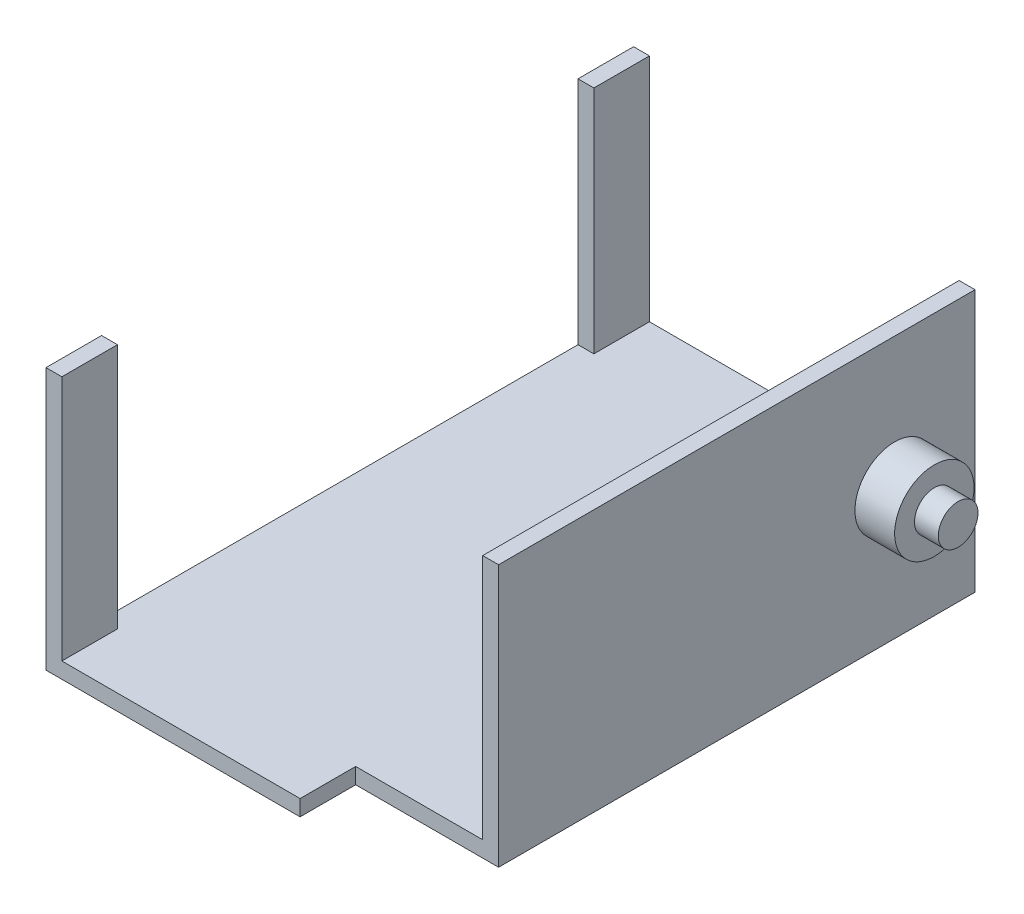
ISO-10303-21;
HEADER;
FILE_DESCRIPTION(('STEP AP214'),'2;1');
FILE_NAME('part.step','',(''),(''),'','','');
FILE_SCHEMA(('AUTOMOTIVE_DESIGN { 1 0 10303 214 1 1 1 1 }'));
ENDSEC;
DATA;
#1=APPLICATION_CONTEXT('core data for automotive mechanical design processes');
#2=APPLICATION_PROTOCOL_DEFINITION('international standard','automotive_design',2000,#1);
#3=PRODUCT_CONTEXT('',#1,'mechanical');
#4=PRODUCT('Part','Part','',(#3));
#5=PRODUCT_RELATED_PRODUCT_CATEGORY('part','',(#4));
#6=PRODUCT_DEFINITION_FORMATION('','',#4);
#7=PRODUCT_DEFINITION_CONTEXT('part definition',#1,'design');
#8=PRODUCT_DEFINITION('design','',#6,#7);
#9=PRODUCT_DEFINITION_SHAPE('','',#8);
#10=(LENGTH_UNIT() NAMED_UNIT(*) SI_UNIT(.MILLI.,.METRE.));
#11=(NAMED_UNIT(*) PLANE_ANGLE_UNIT() SI_UNIT($,.RADIAN.));
#12=(NAMED_UNIT(*) SI_UNIT($,.STERADIAN.) SOLID_ANGLE_UNIT());
#13=UNCERTAINTY_MEASURE_WITH_UNIT(LENGTH_MEASURE(1.E-05),#10,'distance_accuracy_value','');
#14=(GEOMETRIC_REPRESENTATION_CONTEXT(3) GLOBAL_UNCERTAINTY_ASSIGNED_CONTEXT((#13)) GLOBAL_UNIT_ASSIGNED_CONTEXT((#10,
#11,#12)) REPRESENTATION_CONTEXT('',''));
#15=CARTESIAN_POINT('',(0.,0.,0.));
#16=DIRECTION('',(0.,0.,1.));
#17=DIRECTION('',(1.,0.,0.));
#18=AXIS2_PLACEMENT_3D('',#15,#16,#17);
#19=CARTESIAN_POINT('',(0.,2.,0.));
#20=DIRECTION('',(0.,-1.,0.));
#21=DIRECTION('',(0.,0.,-1.));
#22=AXIS2_PLACEMENT_3D('',#19,#20,#21);
#23=PLANE('',#22);
#24=DIRECTION('',(0.,0.,-1.));
#25=VECTOR('',#24,1.);
#26=CARTESIAN_POINT('',(-21.6117936117936,2.,0.));
#27=LINE('',#26,#25);
#28=CARTESIAN_POINT('',(-21.6117936117936,2.,-24.2506142506143));
#29=VERTEX_POINT('',#28);
#30=CARTESIAN_POINT('',(-21.6117936117936,2.,-31.2506142506143));
#31=VERTEX_POINT('',#30);
#32=EDGE_CURVE('E192',#29,#31,#27,.T.);
#33=ORIENTED_EDGE('',*,*,#32,.F.);
#34=DIRECTION('',(-1.,0.,0.));
#35=VECTOR('',#34,1.);
#36=CARTESIAN_POINT('',(0.,2.,-24.2506142506143));
#37=LINE('',#36,#35);
#38=CARTESIAN_POINT('',(-23.6117936117936,2.,-24.2506142506143));
#39=VERTEX_POINT('',#38);
#40=EDGE_CURVE('E167',#29,#39,#37,.T.);
#41=ORIENTED_EDGE('',*,*,#40,.T.);
#42=DIRECTION('',(0.,0.,-1.));
#43=VECTOR('',#42,1.);
#44=CARTESIAN_POINT('',(-23.6117936117936,2.,-24.2506142506143));
#45=LINE('',#44,#43);
#46=CARTESIAN_POINT('',(-23.6117936117936,2.,35.7493857493857));
#47=VERTEX_POINT('',#46);
#48=EDGE_CURVE('E237',#47,#39,#45,.T.);
#49=ORIENTED_EDGE('',*,*,#48,.F.);
#50=DIRECTION('',(1.,0.,0.));
#51=VECTOR('',#50,1.);
#52=CARTESIAN_POINT('',(0.,2.,35.7493857493857));
#53=LINE('',#52,#51);
#54=CARTESIAN_POINT('',(-21.6117936117936,2.,35.7493857493857));
#55=VERTEX_POINT('',#54);
#56=EDGE_CURVE('E70',#47,#55,#53,.T.);
#57=ORIENTED_EDGE('',*,*,#56,.T.);
#58=DIRECTION('',(0.,0.,1.));
#59=VECTOR('',#58,1.);
#60=CARTESIAN_POINT('',(-21.6117936117936,2.,0.));
#61=LINE('',#60,#59);
#62=CARTESIAN_POINT('',(-21.6117936117936,2.,42.7493857493857));
#63=VERTEX_POINT('',#62);
#64=EDGE_CURVE('E234',#55,#63,#61,.T.);
#65=ORIENTED_EDGE('',*,*,#64,.T.);
#66=DIRECTION('',(1.,0.,0.));
#67=VECTOR('',#66,1.);
#68=CARTESIAN_POINT('',(-23.6117936117936,2.,42.7493857493857));
#69=LINE('',#68,#67);
#70=CARTESIAN_POINT('',(8.38820638820637,2.,42.7493857493857));
#71=VERTEX_POINT('',#70);
#72=EDGE_CURVE('E255',#63,#71,#69,.T.);
#73=ORIENTED_EDGE('',*,*,#72,.T.);
#74=DIRECTION('',(0.,0.,1.));
#75=VECTOR('',#74,1.);
#76=CARTESIAN_POINT('',(8.38820638820637,2.,35.7493857493857));
#77=LINE('',#76,#75);
#78=CARTESIAN_POINT('',(8.38820638820637,2.,35.7493857493857));
#79=VERTEX_POINT('',#78);
#80=EDGE_CURVE('E252',#79,#71,#77,.T.);
#81=ORIENTED_EDGE('',*,*,#80,.F.);
#82=DIRECTION('',(1.,0.,0.));
#83=VECTOR('',#82,1.);
#84=CARTESIAN_POINT('',(8.38820638820637,2.,35.7493857493857));
#85=LINE('',#84,#83);
#86=CARTESIAN_POINT('',(24.3882063882064,2.,35.7493857493857));
#87=VERTEX_POINT('',#86);
#88=EDGE_CURVE('E249',#79,#87,#85,.T.);
#89=ORIENTED_EDGE('',*,*,#88,.T.);
#90=DIRECTION('',(0.,0.,-1.));
#91=VECTOR('',#90,1.);
#92=CARTESIAN_POINT('',(24.3882063882064,2.,0.));
#93=LINE('',#92,#91);
#94=CARTESIAN_POINT('',(24.3882063882064,2.,-24.2506142506143));
#95=VERTEX_POINT('',#94);
#96=EDGE_CURVE('E209',#87,#95,#93,.T.);
#97=ORIENTED_EDGE('',*,*,#96,.T.);
#98=DIRECTION('',(1.,0.,0.));
#99=VECTOR('',#98,1.);
#100=CARTESIAN_POINT('',(8.38820638820636,2.,-24.2506142506143));
#101=LINE('',#100,#99);
#102=CARTESIAN_POINT('',(8.38820638820636,2.,-24.2506142506143));
#103=VERTEX_POINT('',#102);
#104=EDGE_CURVE('E246',#103,#95,#101,.T.);
#105=ORIENTED_EDGE('',*,*,#104,.F.);
#106=DIRECTION('',(0.,0.,-1.));
#107=VECTOR('',#106,1.);
#108=CARTESIAN_POINT('',(8.38820638820636,2.,-24.2506142506143));
#109=LINE('',#108,#107);
#110=CARTESIAN_POINT('',(8.38820638820636,2.,-31.2506142506143));
#111=VERTEX_POINT('',#110);
#112=EDGE_CURVE('E243',#103,#111,#109,.T.);
#113=ORIENTED_EDGE('',*,*,#112,.T.);
#114=DIRECTION('',(1.,0.,0.));
#115=VECTOR('',#114,1.);
#116=CARTESIAN_POINT('',(-23.6117936117936,2.,-31.2506142506143));
#117=LINE('',#116,#115);
#118=EDGE_CURVE('E240',#31,#111,#117,.T.);
#119=ORIENTED_EDGE('',*,*,#118,.F.);
#120=EDGE_LOOP('',(#33,#41,#49,#57,#65,#73,#81,#89,#97,#105,#113,#119));
#121=FACE_BOUND('',#120,.T.);
#122=ADVANCED_FACE('F45',(#121),#23,.F.);
#123=CARTESIAN_POINT('',(-23.6117936117936,2.,-24.2506142506143));
#124=DIRECTION('',(1.,0.,0.));
#125=DIRECTION('',(0.,0.,-1.));
#126=AXIS2_PLACEMENT_3D('',#123,#124,#125);
#127=PLANE('',#126);
#128=ORIENTED_EDGE('',*,*,#48,.T.);
#129=DIRECTION('',(0.,1.,0.));
#130=VECTOR('',#129,1.);
#131=CARTESIAN_POINT('',(-23.6117936117936,0.,-24.2506142506143));
#132=LINE('',#131,#130);
#133=CARTESIAN_POINT('',(-23.6117936117936,31.,-24.2506142506143));
#134=VERTEX_POINT('',#133);
#135=EDGE_CURVE('E182',#39,#134,#132,.T.);
#136=ORIENTED_EDGE('',*,*,#135,.T.);
#137=DIRECTION('',(0.,0.,-1.));
#138=VECTOR('',#137,1.);
#139=CARTESIAN_POINT('',(-23.6117936117936,31.,-24.2506142506143));
#140=LINE('',#139,#138);
#141=CARTESIAN_POINT('',(-23.6117936117936,31.,-31.2506142506143));
#142=VERTEX_POINT('',#141);
#143=EDGE_CURVE('E177',#134,#142,#140,.T.);
#144=ORIENTED_EDGE('',*,*,#143,.T.);
#145=DIRECTION('',(0.,-1.,0.));
#146=VECTOR('',#145,1.);
#147=CARTESIAN_POINT('',(-23.6117936117936,2.,-31.2506142506143));
#148=LINE('',#147,#146);
#149=CARTESIAN_POINT('',(-23.6117936117936,0.,-31.2506142506143));
#150=VERTEX_POINT('',#149);
#151=EDGE_CURVE('E49',#142,#150,#148,.T.);
#152=ORIENTED_EDGE('',*,*,#151,.T.);
#153=DIRECTION('',(0.,0.,1.));
#154=VECTOR('',#153,1.);
#155=CARTESIAN_POINT('',(-23.6117936117936,0.,-24.2506142506143));
#156=LINE('',#155,#154);
#157=CARTESIAN_POINT('',(-23.6117936117936,0.,42.7493857493857));
#158=VERTEX_POINT('',#157);
#159=EDGE_CURVE('E241',#150,#158,#156,.T.);
#160=ORIENTED_EDGE('',*,*,#159,.T.);
#161=DIRECTION('',(0.,-1.,0.));
#162=VECTOR('',#161,1.);
#163=CARTESIAN_POINT('',(-23.6117936117936,2.,42.7493857493857));
#164=LINE('',#163,#162);
#165=CARTESIAN_POINT('',(-23.6117936117936,33.,42.7493857493857));
#166=VERTEX_POINT('',#165);
#167=EDGE_CURVE('E54',#166,#158,#164,.T.);
#168=ORIENTED_EDGE('',*,*,#167,.F.);
#169=DIRECTION('',(0.,0.,1.));
#170=VECTOR('',#169,1.);
#171=CARTESIAN_POINT('',(-23.6117936117936,33.,35.7493857493857));
#172=LINE('',#171,#170);
#173=CARTESIAN_POINT('',(-23.6117936117936,33.,35.7493857493857));
#174=VERTEX_POINT('',#173);
#175=EDGE_CURVE('E228',#174,#166,#172,.T.);
#176=ORIENTED_EDGE('',*,*,#175,.F.);
#177=DIRECTION('',(0.,-1.,0.));
#178=VECTOR('',#177,1.);
#179=CARTESIAN_POINT('',(-23.6117936117936,0.,35.7493857493857));
#180=LINE('',#179,#178);
#181=EDGE_CURVE('E215',#174,#47,#180,.T.);
#182=ORIENTED_EDGE('',*,*,#181,.T.);
#183=EDGE_LOOP('',(#128,#136,#144,#152,#160,#168,#176,#182));
#184=FACE_BOUND('',#183,.T.);
#185=ADVANCED_FACE('F294',(#184),#127,.F.);
#186=CARTESIAN_POINT('',(-23.6117936117936,2.,42.7493857493857));
#187=DIRECTION('',(0.,0.,-1.));
#188=DIRECTION('',(-1.,0.,0.));
#189=AXIS2_PLACEMENT_3D('',#186,#187,#188);
#190=PLANE('',#189);
#191=ORIENTED_EDGE('',*,*,#72,.F.);
#192=DIRECTION('',(0.,1.,0.));
#193=VECTOR('',#192,1.);
#194=CARTESIAN_POINT('',(-21.6117936117936,0.,42.7493857493857));
#195=LINE('',#194,#193);
#196=CARTESIAN_POINT('',(-21.6117936117936,33.,42.7493857493857));
#197=VERTEX_POINT('',#196);
#198=EDGE_CURVE('E214',#63,#197,#195,.T.);
#199=ORIENTED_EDGE('',*,*,#198,.T.);
#200=DIRECTION('',(-1.,0.,0.));
#201=VECTOR('',#200,1.);
#202=CARTESIAN_POINT('',(-23.6117936117936,33.,42.7493857493857));
#203=LINE('',#202,#201);
#204=EDGE_CURVE('E219',#197,#166,#203,.T.);
#205=ORIENTED_EDGE('',*,*,#204,.T.);
#206=ORIENTED_EDGE('',*,*,#167,.T.);
#207=DIRECTION('',(1.,0.,0.));
#208=VECTOR('',#207,1.);
#209=CARTESIAN_POINT('',(-23.6117936117936,0.,42.7493857493857));
#210=LINE('',#209,#208);
#211=CARTESIAN_POINT('',(8.38820638820637,0.,42.7493857493857));
#212=VERTEX_POINT('',#211);
#213=EDGE_CURVE('E271',#158,#212,#210,.T.);
#214=ORIENTED_EDGE('',*,*,#213,.T.);
#215=DIRECTION('',(0.,-1.,0.));
#216=VECTOR('',#215,1.);
#217=CARTESIAN_POINT('',(8.38820638820637,2.,42.7493857493857));
#218=LINE('',#217,#216);
#219=EDGE_CURVE('E276',#71,#212,#218,.T.);
#220=ORIENTED_EDGE('',*,*,#219,.F.);
#221=EDGE_LOOP('',(#191,#199,#205,#206,#214,#220));
#222=FACE_BOUND('',#221,.T.);
#223=ADVANCED_FACE('F304',(#222),#190,.F.);
#224=CARTESIAN_POINT('',(8.38820638820637,2.,35.7493857493857));
#225=DIRECTION('',(1.,0.,0.));
#226=DIRECTION('',(0.,0.,-1.));
#227=AXIS2_PLACEMENT_3D('',#224,#225,#226);
#228=PLANE('',#227);
#229=DIRECTION('',(0.,0.,1.));
#230=VECTOR('',#229,1.);
#231=CARTESIAN_POINT('',(8.38820638820637,0.,35.7493857493857));
#232=LINE('',#231,#230);
#233=CARTESIAN_POINT('',(8.38820638820637,0.,35.7493857493857));
#234=VERTEX_POINT('',#233);
#235=EDGE_CURVE('E268',#234,#212,#232,.T.);
#236=ORIENTED_EDGE('',*,*,#235,.F.);
#237=DIRECTION('',(0.,-1.,0.));
#238=VECTOR('',#237,1.);
#239=CARTESIAN_POINT('',(8.38820638820637,2.,35.7493857493857));
#240=LINE('',#239,#238);
#241=EDGE_CURVE('E279',#79,#234,#240,.T.);
#242=ORIENTED_EDGE('',*,*,#241,.F.);
#243=ORIENTED_EDGE('',*,*,#80,.T.);
#244=ORIENTED_EDGE('',*,*,#219,.T.);
#245=EDGE_LOOP('',(#236,#242,#243,#244));
#246=FACE_BOUND('',#245,.T.);
#247=ADVANCED_FACE('F306',(#246),#228,.T.);
#248=CARTESIAN_POINT('',(8.38820638820637,2.,35.7493857493857));
#249=DIRECTION('',(0.,0.,-1.));
#250=DIRECTION('',(-1.,0.,0.));
#251=AXIS2_PLACEMENT_3D('',#248,#249,#250);
#252=PLANE('',#251);
#253=DIRECTION('',(1.,0.,0.));
#254=VECTOR('',#253,1.);
#255=CARTESIAN_POINT('',(8.38820638820637,0.,35.7493857493857));
#256=LINE('',#255,#254);
#257=CARTESIAN_POINT('',(26.3882063882064,0.,35.7493857493857));
#258=VERTEX_POINT('',#257);
#259=EDGE_CURVE('E266',#234,#258,#256,.T.);
#260=ORIENTED_EDGE('',*,*,#259,.T.);
#261=DIRECTION('',(0.,-1.,0.));
#262=VECTOR('',#261,1.);
#263=CARTESIAN_POINT('',(26.3882063882064,2.,35.7493857493857));
#264=LINE('',#263,#262);
#265=CARTESIAN_POINT('',(26.3882063882064,33.,35.7493857493857));
#266=VERTEX_POINT('',#265);
#267=EDGE_CURVE('E281',#266,#258,#264,.T.);
#268=ORIENTED_EDGE('',*,*,#267,.F.);
#269=DIRECTION('',(1.,0.,0.));
#270=VECTOR('',#269,1.);
#271=CARTESIAN_POINT('',(24.3882063882064,33.,35.7493857493857));
#272=LINE('',#271,#270);
#273=CARTESIAN_POINT('',(24.3882063882064,33.,35.7493857493857));
#274=VERTEX_POINT('',#273);
#275=EDGE_CURVE('E206',#274,#266,#272,.T.);
#276=ORIENTED_EDGE('',*,*,#275,.F.);
#277=DIRECTION('',(0.,-1.,0.));
#278=VECTOR('',#277,1.);
#279=CARTESIAN_POINT('',(24.3882063882064,0.,35.7493857493857));
#280=LINE('',#279,#278);
#281=EDGE_CURVE('E195',#274,#87,#280,.T.);
#282=ORIENTED_EDGE('',*,*,#281,.T.);
#283=ORIENTED_EDGE('',*,*,#88,.F.);
#284=ORIENTED_EDGE('',*,*,#241,.T.);
#285=EDGE_LOOP('',(#260,#268,#276,#282,#283,#284));
#286=FACE_BOUND('',#285,.T.);
#287=ADVANCED_FACE('F345',(#286),#252,.F.);
#288=CARTESIAN_POINT('',(26.3882063882064,2.,-24.2506142506143));
#289=DIRECTION('',(1.,0.,0.));
#290=DIRECTION('',(0.,0.,-1.));
#291=AXIS2_PLACEMENT_3D('',#288,#289,#290);
#292=PLANE('',#291);
#293=CARTESIAN_POINT('',(26.3882063882064,16.4627505957344,-14.1276648267168));
#294=DIRECTION('',(1.,0.,0.));
#295=DIRECTION('',(0.,0.,-1.));
#296=AXIS2_PLACEMENT_3D('',#293,#294,#295);
#297=CIRCLE('',#296,5.);
#298=CARTESIAN_POINT('',(26.3882063882064,16.4627505957344,-19.1276648267168));
#299=VERTEX_POINT('',#298);
#300=EDGE_CURVE('E405',#299,#299,#297,.T.);
#301=ORIENTED_EDGE('',*,*,#300,.F.);
#302=EDGE_LOOP('',(#301));
#303=FACE_BOUND('',#302,.T.);
#304=DIRECTION('',(0.,0.,1.));
#305=VECTOR('',#304,1.);
#306=CARTESIAN_POINT('',(26.3882063882064,0.,-24.2506142506143));
#307=LINE('',#306,#305);
#308=CARTESIAN_POINT('',(26.3882063882064,0.,-24.2506142506143));
#309=VERTEX_POINT('',#308);
#310=EDGE_CURVE('E263',#309,#258,#307,.T.);
#311=ORIENTED_EDGE('',*,*,#310,.F.);
#312=DIRECTION('',(0.,-1.,0.));
#313=VECTOR('',#312,1.);
#314=CARTESIAN_POINT('',(26.3882063882064,2.,-24.2506142506143));
#315=LINE('',#314,#313);
#316=CARTESIAN_POINT('',(26.3882063882064,33.,-24.2506142506143));
#317=VERTEX_POINT('',#316);
#318=EDGE_CURVE('E284',#317,#309,#315,.T.);
#319=ORIENTED_EDGE('',*,*,#318,.F.);
#320=DIRECTION('',(0.,0.,1.));
#321=VECTOR('',#320,1.);
#322=CARTESIAN_POINT('',(26.3882063882064,33.,35.7493857493857));
#323=LINE('',#322,#321);
#324=EDGE_CURVE('E194',#317,#266,#323,.T.);
#325=ORIENTED_EDGE('',*,*,#324,.T.);
#326=ORIENTED_EDGE('',*,*,#267,.T.);
#327=EDGE_LOOP('',(#311,#319,#325,#326));
#328=FACE_BOUND('',#327,.T.);
#329=ADVANCED_FACE('F348',(#303,#328),#292,.T.);
#330=CARTESIAN_POINT('',(8.38820638820636,2.,-24.2506142506143));
#331=DIRECTION('',(0.,0.,-1.));
#332=DIRECTION('',(-1.,0.,0.));
#333=AXIS2_PLACEMENT_3D('',#330,#331,#332);
#334=PLANE('',#333);
#335=ORIENTED_EDGE('',*,*,#104,.T.);
#336=DIRECTION('',(0.,1.,0.));
#337=VECTOR('',#336,1.);
#338=CARTESIAN_POINT('',(24.3882063882064,0.,-24.2506142506143));
#339=LINE('',#338,#337);
#340=CARTESIAN_POINT('',(24.3882063882064,33.,-24.2506142506143));
#341=VERTEX_POINT('',#340);
#342=EDGE_CURVE('E198',#95,#341,#339,.T.);
#343=ORIENTED_EDGE('',*,*,#342,.T.);
#344=DIRECTION('',(1.,0.,0.));
#345=VECTOR('',#344,1.);
#346=CARTESIAN_POINT('',(24.3882063882064,33.,-24.2506142506143));
#347=LINE('',#346,#345);
#348=EDGE_CURVE('E203',#341,#317,#347,.T.);
#349=ORIENTED_EDGE('',*,*,#348,.T.);
#350=ORIENTED_EDGE('',*,*,#318,.T.);
#351=DIRECTION('',(1.,0.,0.));
#352=VECTOR('',#351,1.);
#353=CARTESIAN_POINT('',(8.38820638820636,0.,-24.2506142506143));
#354=LINE('',#353,#352);
#355=CARTESIAN_POINT('',(8.38820638820636,0.,-24.2506142506143));
#356=VERTEX_POINT('',#355);
#357=EDGE_CURVE('E261',#356,#309,#354,.T.);
#358=ORIENTED_EDGE('',*,*,#357,.F.);
#359=DIRECTION('',(0.,-1.,0.));
#360=VECTOR('',#359,1.);
#361=CARTESIAN_POINT('',(8.38820638820636,2.,-24.2506142506143));
#362=LINE('',#361,#360);
#363=EDGE_CURVE('E287',#103,#356,#362,.T.);
#364=ORIENTED_EDGE('',*,*,#363,.F.);
#365=EDGE_LOOP('',(#335,#343,#349,#350,#358,#364));
#366=FACE_BOUND('',#365,.T.);
#367=ADVANCED_FACE('F352',(#366),#334,.T.);
#368=CARTESIAN_POINT('',(8.38820638820636,2.,-24.2506142506143));
#369=DIRECTION('',(-1.,0.,0.));
#370=DIRECTION('',(0.,0.,1.));
#371=AXIS2_PLACEMENT_3D('',#368,#369,#370);
#372=PLANE('',#371);
#373=DIRECTION('',(0.,0.,-1.));
#374=VECTOR('',#373,1.);
#375=CARTESIAN_POINT('',(8.38820638820636,0.,-24.2506142506143));
#376=LINE('',#375,#374);
#377=CARTESIAN_POINT('',(8.38820638820636,0.,-31.2506142506143));
#378=VERTEX_POINT('',#377);
#379=EDGE_CURVE('E258',#356,#378,#376,.T.);
#380=ORIENTED_EDGE('',*,*,#379,.T.);
#381=DIRECTION('',(0.,-1.,0.));
#382=VECTOR('',#381,1.);
#383=CARTESIAN_POINT('',(8.38820638820636,2.,-31.2506142506143));
#384=LINE('',#383,#382);
#385=EDGE_CURVE('E288',#111,#378,#384,.T.);
#386=ORIENTED_EDGE('',*,*,#385,.F.);
#387=ORIENTED_EDGE('',*,*,#112,.F.);
#388=ORIENTED_EDGE('',*,*,#363,.T.);
#389=EDGE_LOOP('',(#380,#386,#387,#388));
#390=FACE_BOUND('',#389,.T.);
#391=ADVANCED_FACE('F355',(#390),#372,.F.);
#392=CARTESIAN_POINT('',(-23.6117936117936,2.,-31.2506142506143));
#393=DIRECTION('',(0.,0.,-1.));
#394=DIRECTION('',(-1.,0.,0.));
#395=AXIS2_PLACEMENT_3D('',#392,#393,#394);
#396=PLANE('',#395);
#397=DIRECTION('',(0.,1.,0.));
#398=VECTOR('',#397,1.);
#399=CARTESIAN_POINT('',(-21.6117936117936,0.,-31.2506142506143));
#400=LINE('',#399,#398);
#401=CARTESIAN_POINT('',(-21.6117936117936,31.,-31.2506142506143));
#402=VERTEX_POINT('',#401);
#403=EDGE_CURVE('E62',#31,#402,#400,.T.);
#404=ORIENTED_EDGE('',*,*,#403,.F.);
#405=ORIENTED_EDGE('',*,*,#118,.T.);
#406=ORIENTED_EDGE('',*,*,#385,.T.);
#407=DIRECTION('',(1.,0.,0.));
#408=VECTOR('',#407,1.);
#409=CARTESIAN_POINT('',(-23.6117936117936,0.,-31.2506142506143));
#410=LINE('',#409,#408);
#411=EDGE_CURVE('E236',#150,#378,#410,.T.);
#412=ORIENTED_EDGE('',*,*,#411,.F.);
#413=ORIENTED_EDGE('',*,*,#151,.F.);
#414=DIRECTION('',(1.,0.,0.));
#415=VECTOR('',#414,1.);
#416=CARTESIAN_POINT('',(-23.6117936117936,31.,-31.2506142506143));
#417=LINE('',#416,#415);
#418=EDGE_CURVE('E170',#142,#402,#417,.T.);
#419=ORIENTED_EDGE('',*,*,#418,.T.);
#420=EDGE_LOOP('',(#404,#405,#406,#412,#413,#419));
#421=FACE_BOUND('',#420,.T.);
#422=ADVANCED_FACE('F47',(#421),#396,.T.);
#423=CARTESIAN_POINT('',(0.,0.,0.));
#424=DIRECTION('',(0.,-1.,0.));
#425=DIRECTION('',(0.,0.,-1.));
#426=AXIS2_PLACEMENT_3D('',#423,#424,#425);
#427=PLANE('',#426);
#428=ORIENTED_EDGE('',*,*,#411,.T.);
#429=ORIENTED_EDGE('',*,*,#379,.F.);
#430=ORIENTED_EDGE('',*,*,#357,.T.);
#431=ORIENTED_EDGE('',*,*,#310,.T.);
#432=ORIENTED_EDGE('',*,*,#259,.F.);
#433=ORIENTED_EDGE('',*,*,#235,.T.);
#434=ORIENTED_EDGE('',*,*,#213,.F.);
#435=ORIENTED_EDGE('',*,*,#159,.F.);
#436=EDGE_LOOP('',(#428,#429,#430,#431,#432,#433,#434,#435));
#437=FACE_BOUND('',#436,.T.);
#438=ADVANCED_FACE('F297',(#437),#427,.T.);
#439=CARTESIAN_POINT('',(-21.6117936117936,0.,35.7493857493857));
#440=DIRECTION('',(1.,0.,0.));
#441=DIRECTION('',(0.,0.,-1.));
#442=AXIS2_PLACEMENT_3D('',#439,#440,#441);
#443=PLANE('',#442);
#444=ORIENTED_EDGE('',*,*,#64,.F.);
#445=DIRECTION('',(0.,1.,0.));
#446=VECTOR('',#445,1.);
#447=CARTESIAN_POINT('',(-21.6117936117936,0.,35.7493857493857));
#448=LINE('',#447,#446);
#449=CARTESIAN_POINT('',(-21.6117936117936,33.,35.7493857493857));
#450=VERTEX_POINT('',#449);
#451=EDGE_CURVE('E218',#55,#450,#448,.T.);
#452=ORIENTED_EDGE('',*,*,#451,.T.);
#453=DIRECTION('',(0.,0.,1.));
#454=VECTOR('',#453,1.);
#455=CARTESIAN_POINT('',(-21.6117936117936,33.,35.7493857493857));
#456=LINE('',#455,#454);
#457=EDGE_CURVE('E224',#450,#197,#456,.T.);
#458=ORIENTED_EDGE('',*,*,#457,.T.);
#459=ORIENTED_EDGE('',*,*,#198,.F.);
#460=EDGE_LOOP('',(#444,#452,#458,#459));
#461=FACE_BOUND('',#460,.T.);
#462=ADVANCED_FACE('F313',(#461),#443,.T.);
#463=CARTESIAN_POINT('',(0.,0.,35.7493857493857));
#464=DIRECTION('',(0.,0.,-1.));
#465=DIRECTION('',(-1.,0.,0.));
#466=AXIS2_PLACEMENT_3D('',#463,#464,#465);
#467=PLANE('',#466);
#468=ORIENTED_EDGE('',*,*,#56,.F.);
#469=ORIENTED_EDGE('',*,*,#181,.F.);
#470=DIRECTION('',(-1.,0.,0.));
#471=VECTOR('',#470,1.);
#472=CARTESIAN_POINT('',(-23.6117936117936,33.,35.7493857493857));
#473=LINE('',#472,#471);
#474=EDGE_CURVE('E221',#450,#174,#473,.T.);
#475=ORIENTED_EDGE('',*,*,#474,.F.);
#476=ORIENTED_EDGE('',*,*,#451,.F.);
#477=EDGE_LOOP('',(#468,#469,#475,#476));
#478=FACE_BOUND('',#477,.T.);
#479=ADVANCED_FACE('F320',(#478),#467,.T.);
#480=CARTESIAN_POINT('',(-23.6117936117936,33.,35.7493857493857));
#481=DIRECTION('',(0.,1.,0.));
#482=DIRECTION('',(0.,0.,1.));
#483=AXIS2_PLACEMENT_3D('',#480,#481,#482);
#484=PLANE('',#483);
#485=ORIENTED_EDGE('',*,*,#204,.F.);
#486=ORIENTED_EDGE('',*,*,#457,.F.);
#487=ORIENTED_EDGE('',*,*,#474,.T.);
#488=ORIENTED_EDGE('',*,*,#175,.T.);
#489=EDGE_LOOP('',(#485,#486,#487,#488));
#490=FACE_BOUND('',#489,.T.);
#491=ADVANCED_FACE('F317',(#490),#484,.T.);
#492=CARTESIAN_POINT('',(24.3882063882064,0.,0.));
#493=DIRECTION('',(-1.,0.,0.));
#494=DIRECTION('',(0.,0.,1.));
#495=AXIS2_PLACEMENT_3D('',#492,#493,#494);
#496=PLANE('',#495);
#497=ORIENTED_EDGE('',*,*,#96,.F.);
#498=ORIENTED_EDGE('',*,*,#281,.F.);
#499=DIRECTION('',(0.,0.,1.));
#500=VECTOR('',#499,1.);
#501=CARTESIAN_POINT('',(24.3882063882064,33.,35.7493857493857));
#502=LINE('',#501,#500);
#503=EDGE_CURVE('E200',#341,#274,#502,.T.);
#504=ORIENTED_EDGE('',*,*,#503,.F.);
#505=ORIENTED_EDGE('',*,*,#342,.F.);
#506=EDGE_LOOP('',(#497,#498,#504,#505));
#507=FACE_BOUND('',#506,.T.);
#508=ADVANCED_FACE('F327',(#507),#496,.T.);
#509=CARTESIAN_POINT('',(24.3882063882064,33.,35.7493857493857));
#510=DIRECTION('',(0.,1.,0.));
#511=DIRECTION('',(0.,0.,1.));
#512=AXIS2_PLACEMENT_3D('',#509,#510,#511);
#513=PLANE('',#512);
#514=ORIENTED_EDGE('',*,*,#324,.F.);
#515=ORIENTED_EDGE('',*,*,#348,.F.);
#516=ORIENTED_EDGE('',*,*,#503,.T.);
#517=ORIENTED_EDGE('',*,*,#275,.T.);
#518=EDGE_LOOP('',(#514,#515,#516,#517));
#519=FACE_BOUND('',#518,.T.);
#520=ADVANCED_FACE('F369',(#519),#513,.T.);
#521=CARTESIAN_POINT('',(-21.6117936117936,0.,-24.2506142506143));
#522=DIRECTION('',(-1.,0.,0.));
#523=DIRECTION('',(0.,0.,1.));
#524=AXIS2_PLACEMENT_3D('',#521,#522,#523);
#525=PLANE('',#524);
#526=DIRECTION('',(0.,1.,0.));
#527=VECTOR('',#526,1.);
#528=CARTESIAN_POINT('',(-21.6117936117936,0.,-24.2506142506143));
#529=LINE('',#528,#527);
#530=CARTESIAN_POINT('',(-21.6117936117936,31.,-24.2506142506143));
#531=VERTEX_POINT('',#530);
#532=EDGE_CURVE('E161',#29,#531,#529,.T.);
#533=ORIENTED_EDGE('',*,*,#532,.F.);
#534=ORIENTED_EDGE('',*,*,#32,.T.);
#535=ORIENTED_EDGE('',*,*,#403,.T.);
#536=DIRECTION('',(0.,0.,-1.));
#537=VECTOR('',#536,1.);
#538=CARTESIAN_POINT('',(-21.6117936117936,31.,-24.2506142506143));
#539=LINE('',#538,#537);
#540=EDGE_CURVE('E173',#531,#402,#539,.T.);
#541=ORIENTED_EDGE('',*,*,#540,.F.);
#542=EDGE_LOOP('',(#533,#534,#535,#541));
#543=FACE_BOUND('',#542,.T.);
#544=ADVANCED_FACE('F174',(#543),#525,.F.);
#545=CARTESIAN_POINT('',(0.,0.,-24.2506142506143));
#546=DIRECTION('',(0.,0.,1.));
#547=DIRECTION('',(1.,0.,0.));
#548=AXIS2_PLACEMENT_3D('',#545,#546,#547);
#549=PLANE('',#548);
#550=ORIENTED_EDGE('',*,*,#40,.F.);
#551=ORIENTED_EDGE('',*,*,#532,.T.);
#552=DIRECTION('',(1.,0.,0.));
#553=VECTOR('',#552,1.);
#554=CARTESIAN_POINT('',(-23.6117936117936,31.,-24.2506142506143));
#555=LINE('',#554,#553);
#556=EDGE_CURVE('E165',#134,#531,#555,.T.);
#557=ORIENTED_EDGE('',*,*,#556,.F.);
#558=ORIENTED_EDGE('',*,*,#135,.F.);
#559=EDGE_LOOP('',(#550,#551,#557,#558));
#560=FACE_BOUND('',#559,.T.);
#561=ADVANCED_FACE('F163',(#560),#549,.T.);
#562=CARTESIAN_POINT('',(-23.6117936117936,31.,-24.2506142506143));
#563=DIRECTION('',(0.,1.,0.));
#564=DIRECTION('',(-1.,0.,0.));
#565=AXIS2_PLACEMENT_3D('',#562,#563,#564);
#566=PLANE('',#565);
#567=ORIENTED_EDGE('',*,*,#418,.F.);
#568=ORIENTED_EDGE('',*,*,#143,.F.);
#569=ORIENTED_EDGE('',*,*,#556,.T.);
#570=ORIENTED_EDGE('',*,*,#540,.T.);
#571=EDGE_LOOP('',(#567,#568,#569,#570));
#572=FACE_BOUND('',#571,.T.);
#573=ADVANCED_FACE('F180',(#572),#566,.T.);
#574=CARTESIAN_POINT('',(31.3882063882064,16.4627505957344,-14.1276648267168));
#575=DIRECTION('',(-1.,0.,0.));
#576=DIRECTION('',(0.,0.,1.));
#577=AXIS2_PLACEMENT_3D('',#574,#575,#576);
#578=CYLINDRICAL_SURFACE('',#577,5.);
#579=CARTESIAN_POINT('',(31.3882063882064,16.4627505957344,-14.1276648267168));
#580=DIRECTION('',(1.,0.,0.));
#581=DIRECTION('',(0.,0.,-1.));
#582=AXIS2_PLACEMENT_3D('',#579,#580,#581);
#583=CIRCLE('',#582,5.);
#584=CARTESIAN_POINT('',(31.3882063882064,16.4627505957344,-19.1276648267168));
#585=VERTEX_POINT('',#584);
#586=EDGE_CURVE('E188',#585,#585,#583,.T.);
#587=ORIENTED_EDGE('',*,*,#586,.F.);
#588=EDGE_LOOP('',(#587));
#589=FACE_BOUND('',#588,.T.);
#590=ORIENTED_EDGE('',*,*,#300,.T.);
#591=EDGE_LOOP('',(#590));
#592=FACE_BOUND('',#591,.T.);
#593=ADVANCED_FACE('F383',(#589,#592),#578,.T.);
#594=CARTESIAN_POINT('',(31.3882063882064,16.4627505957344,-14.1276648267168));
#595=DIRECTION('',(1.,0.,0.));
#596=DIRECTION('',(0.,0.,-1.));
#597=AXIS2_PLACEMENT_3D('',#594,#595,#596);
#598=PLANE('',#597);
#599=CARTESIAN_POINT('',(31.3882063882064,16.4627505957344,-14.1276648267168));
#600=DIRECTION('',(1.,0.,0.));
#601=DIRECTION('',(0.,0.,-1.));
#602=AXIS2_PLACEMENT_3D('',#599,#600,#601);
#603=CIRCLE('',#602,2.5);
#604=CARTESIAN_POINT('',(31.3882063882064,16.4627505957344,-16.6276648267168));
#605=VERTEX_POINT('',#604);
#606=EDGE_CURVE('E11',#605,#605,#603,.T.);
#607=ORIENTED_EDGE('',*,*,#606,.F.);
#608=EDGE_LOOP('',(#607));
#609=FACE_BOUND('',#608,.T.);
#610=ORIENTED_EDGE('',*,*,#586,.T.);
#611=EDGE_LOOP('',(#610));
#612=FACE_BOUND('',#611,.T.);
#613=ADVANCED_FACE('F388',(#609,#612),#598,.T.);
#614=CARTESIAN_POINT('',(34.3882063882064,16.4627505957344,-14.1276648267168));
#615=DIRECTION('',(-1.,0.,0.));
#616=DIRECTION('',(0.,0.,1.));
#617=AXIS2_PLACEMENT_3D('',#614,#615,#616);
#618=CYLINDRICAL_SURFACE('',#617,2.5);
#619=CARTESIAN_POINT('',(34.3882063882064,16.4627505957344,-14.1276648267168));
#620=DIRECTION('',(1.,0.,0.));
#621=DIRECTION('',(0.,0.,-1.));
#622=AXIS2_PLACEMENT_3D('',#619,#620,#621);
#623=CIRCLE('',#622,2.5);
#624=CARTESIAN_POINT('',(34.3882063882064,16.4627505957344,-16.6276648267168));
#625=VERTEX_POINT('',#624);
#626=EDGE_CURVE('E404',#625,#625,#623,.T.);
#627=ORIENTED_EDGE('',*,*,#626,.F.);
#628=EDGE_LOOP('',(#627));
#629=FACE_BOUND('',#628,.T.);
#630=ORIENTED_EDGE('',*,*,#606,.T.);
#631=EDGE_LOOP('',(#630));
#632=FACE_BOUND('',#631,.T.);
#633=ADVANCED_FACE('F392',(#629,#632),#618,.T.);
#634=CARTESIAN_POINT('',(34.3882063882064,16.4627505957344,-14.1276648267168));
#635=DIRECTION('',(1.,0.,0.));
#636=DIRECTION('',(0.,0.,-1.));
#637=AXIS2_PLACEMENT_3D('',#634,#635,#636);
#638=PLANE('',#637);
#639=ORIENTED_EDGE('',*,*,#626,.T.);
#640=EDGE_LOOP('',(#639));
#641=FACE_BOUND('',#640,.T.);
#642=ADVANCED_FACE('F396',(#641),#638,.T.);
#643=CLOSED_SHELL('',(#122,#185,#223,#247,#287,#329,#367,#391,#422,#438,#462,#479,#491,#508,
#520,#544,#561,#573,#593,#613,#633,#642));
#644=MANIFOLD_SOLID_BREP('B2',#643);
#645=ADVANCED_BREP_SHAPE_REPRESENTATION('',(#18,#644),#14);
#646=SHAPE_DEFINITION_REPRESENTATION(#9,#645);
ENDSEC;
END-ISO-10303-21;
